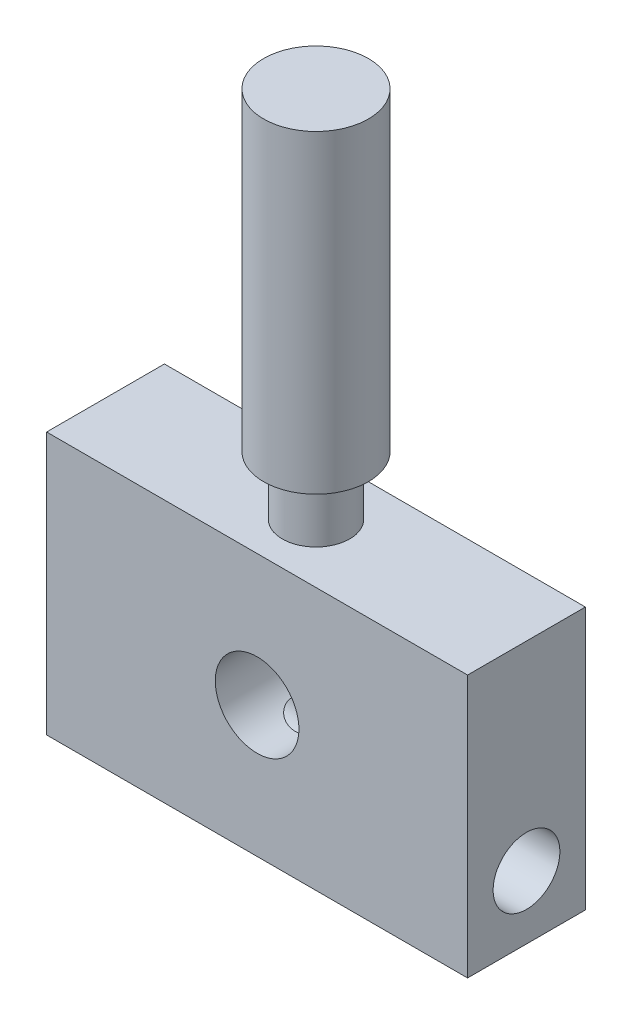
ISO-10303-21;
HEADER;
FILE_DESCRIPTION(('STEP AP214'),'2;1');
FILE_NAME('part.step','',(''),(''),'','','');
FILE_SCHEMA(('AUTOMOTIVE_DESIGN { 1 0 10303 214 1 1 1 1 }'));
ENDSEC;
DATA;
#1=APPLICATION_CONTEXT('core data for automotive mechanical design processes');
#2=APPLICATION_PROTOCOL_DEFINITION('international standard','automotive_design',2000,#1);
#3=PRODUCT_CONTEXT('',#1,'mechanical');
#4=PRODUCT('Part','Part','',(#3));
#5=PRODUCT_RELATED_PRODUCT_CATEGORY('part','',(#4));
#6=PRODUCT_DEFINITION_FORMATION('','',#4);
#7=PRODUCT_DEFINITION_CONTEXT('part definition',#1,'design');
#8=PRODUCT_DEFINITION('design','',#6,#7);
#9=PRODUCT_DEFINITION_SHAPE('','',#8);
#10=(LENGTH_UNIT() NAMED_UNIT(*) SI_UNIT(.MILLI.,.METRE.));
#11=(NAMED_UNIT(*) PLANE_ANGLE_UNIT() SI_UNIT($,.RADIAN.));
#12=(NAMED_UNIT(*) SI_UNIT($,.STERADIAN.) SOLID_ANGLE_UNIT());
#13=UNCERTAINTY_MEASURE_WITH_UNIT(LENGTH_MEASURE(1.E-05),#10,'distance_accuracy_value','');
#14=(GEOMETRIC_REPRESENTATION_CONTEXT(3) GLOBAL_UNCERTAINTY_ASSIGNED_CONTEXT((#13)) GLOBAL_UNIT_ASSIGNED_CONTEXT((#10,
#11,#12)) REPRESENTATION_CONTEXT('',''));
#15=CARTESIAN_POINT('',(0.,0.,0.));
#16=DIRECTION('',(0.,0.,1.));
#17=DIRECTION('',(1.,0.,0.));
#18=AXIS2_PLACEMENT_3D('',#15,#16,#17);
#19=CARTESIAN_POINT('',(53.599909322955,-33.4084973166369,14.9999999999997));
#20=DIRECTION('',(-1.,0.,0.));
#21=DIRECTION('',(0.,0.,1.));
#22=AXIS2_PLACEMENT_3D('',#19,#20,#21);
#23=PLANE('',#22);
#24=CARTESIAN_POINT('',(53.599909322955,-17.2854115069511,0.));
#25=DIRECTION('',(-1.,0.,0.));
#26=DIRECTION('',(0.,0.,1.));
#27=AXIS2_PLACEMENT_3D('',#24,#25,#26);
#28=CIRCLE('',#27,8.5);
#29=CARTESIAN_POINT('',(53.599909322955,-17.2854115069511,8.5));
#30=VERTEX_POINT('',#29);
#31=EDGE_CURVE('E141',#30,#30,#28,.T.);
#32=ORIENTED_EDGE('',*,*,#31,.T.);
#33=EDGE_LOOP('',(#32));
#34=FACE_BOUND('',#33,.T.);
#35=DIRECTION('',(0.,1.,0.));
#36=VECTOR('',#35,1.);
#37=CARTESIAN_POINT('',(53.599909322955,-33.4084973166369,-15.0000000000006));
#38=LINE('',#37,#36);
#39=CARTESIAN_POINT('',(53.599909322955,-33.4084973166369,-15.0000000000006));
#40=VERTEX_POINT('',#39);
#41=CARTESIAN_POINT('',(53.599909322955,33.4084973166368,-15.0000000000006));
#42=VERTEX_POINT('',#41);
#43=EDGE_CURVE('E104',#40,#42,#38,.T.);
#44=ORIENTED_EDGE('',*,*,#43,.T.);
#45=DIRECTION('',(0.,0.,-1.));
#46=VECTOR('',#45,1.);
#47=CARTESIAN_POINT('',(53.599909322955,33.4084973166368,14.9999999999997));
#48=LINE('',#47,#46);
#49=CARTESIAN_POINT('',(53.599909322955,33.4084973166368,14.9999999999997));
#50=VERTEX_POINT('',#49);
#51=EDGE_CURVE('E46',#50,#42,#48,.T.);
#52=ORIENTED_EDGE('',*,*,#51,.F.);
#53=DIRECTION('',(0.,1.,0.));
#54=VECTOR('',#53,1.);
#55=CARTESIAN_POINT('',(53.599909322955,-33.4084973166369,14.9999999999997));
#56=LINE('',#55,#54);
#57=CARTESIAN_POINT('',(53.599909322955,-33.4084973166369,14.9999999999997));
#58=VERTEX_POINT('',#57);
#59=EDGE_CURVE('E90',#58,#50,#56,.T.);
#60=ORIENTED_EDGE('',*,*,#59,.F.);
#61=DIRECTION('',(0.,0.,-1.));
#62=VECTOR('',#61,1.);
#63=CARTESIAN_POINT('',(53.599909322955,-33.4084973166369,14.9999999999997));
#64=LINE('',#63,#62);
#65=EDGE_CURVE('E100',#58,#40,#64,.T.);
#66=ORIENTED_EDGE('',*,*,#65,.T.);
#67=EDGE_LOOP('',(#44,#52,#60,#66));
#68=FACE_BOUND('',#67,.T.);
#69=ADVANCED_FACE('F32',(#34,#68),#23,.F.);
#70=CARTESIAN_POINT('',(-53.5999093229551,33.4084973166369,14.9999999999997));
#71=DIRECTION('',(0.,-1.,0.));
#72=DIRECTION('',(0.,0.,-1.));
#73=AXIS2_PLACEMENT_3D('',#70,#71,#72);
#74=PLANE('',#73);
#75=CARTESIAN_POINT('',(0.,33.4084973166369,0.));
#76=DIRECTION('',(0.,-1.,0.));
#77=DIRECTION('',(0.,0.,-1.));
#78=AXIS2_PLACEMENT_3D('',#75,#76,#77);
#79=CIRCLE('',#78,8.58788191890655);
#80=CARTESIAN_POINT('',(0.,33.4084973166369,-8.58788191890655));
#81=VERTEX_POINT('',#80);
#82=EDGE_CURVE('E11',#81,#81,#79,.F.);
#83=ORIENTED_EDGE('',*,*,#82,.F.);
#84=EDGE_LOOP('',(#83));
#85=FACE_BOUND('',#84,.T.);
#86=DIRECTION('',(-1.,0.,0.));
#87=VECTOR('',#86,1.);
#88=CARTESIAN_POINT('',(-53.599909322955,33.4084973166369,-15.0000000000006));
#89=LINE('',#88,#87);
#90=CARTESIAN_POINT('',(-53.599909322955,33.4084973166369,-15.0000000000006));
#91=VERTEX_POINT('',#90);
#92=EDGE_CURVE('E95',#42,#91,#89,.T.);
#93=ORIENTED_EDGE('',*,*,#92,.T.);
#94=DIRECTION('',(0.,0.,-1.));
#95=VECTOR('',#94,1.);
#96=CARTESIAN_POINT('',(-53.5999093229551,33.4084973166369,14.9999999999997));
#97=LINE('',#96,#95);
#98=CARTESIAN_POINT('',(-53.5999093229551,33.4084973166369,14.9999999999997));
#99=VERTEX_POINT('',#98);
#100=EDGE_CURVE('E93',#99,#91,#97,.T.);
#101=ORIENTED_EDGE('',*,*,#100,.F.);
#102=DIRECTION('',(-1.,0.,0.));
#103=VECTOR('',#102,1.);
#104=CARTESIAN_POINT('',(-53.5999093229551,33.4084973166369,14.9999999999997));
#105=LINE('',#104,#103);
#106=EDGE_CURVE('E85',#50,#99,#105,.T.);
#107=ORIENTED_EDGE('',*,*,#106,.F.);
#108=ORIENTED_EDGE('',*,*,#51,.T.);
#109=EDGE_LOOP('',(#93,#101,#107,#108));
#110=FACE_BOUND('',#109,.T.);
#111=ADVANCED_FACE('F94',(#85,#110),#74,.F.);
#112=CARTESIAN_POINT('',(-53.5999093229551,-33.4084973166368,14.9999999999997));
#113=DIRECTION('',(1.,0.,0.));
#114=DIRECTION('',(0.,0.,-1.));
#115=AXIS2_PLACEMENT_3D('',#112,#113,#114);
#116=PLANE('',#115);
#117=CARTESIAN_POINT('',(-53.5999093229551,-17.2854115069511,0.));
#118=DIRECTION('',(-1.,0.,0.));
#119=DIRECTION('',(0.,0.,1.));
#120=AXIS2_PLACEMENT_3D('',#117,#118,#119);
#121=CIRCLE('',#120,8.5);
#122=CARTESIAN_POINT('',(-53.5999093229551,-17.2854115069511,8.5));
#123=VERTEX_POINT('',#122);
#124=EDGE_CURVE('E144',#123,#123,#121,.T.);
#125=ORIENTED_EDGE('',*,*,#124,.F.);
#126=EDGE_LOOP('',(#125));
#127=FACE_BOUND('',#126,.T.);
#128=DIRECTION('',(0.,-1.,0.));
#129=VECTOR('',#128,1.);
#130=CARTESIAN_POINT('',(-53.599909322955,-33.4084973166368,-15.0000000000006));
#131=LINE('',#130,#129);
#132=CARTESIAN_POINT('',(-53.599909322955,-33.4084973166368,-15.0000000000006));
#133=VERTEX_POINT('',#132);
#134=EDGE_CURVE('E71',#91,#133,#131,.T.);
#135=ORIENTED_EDGE('',*,*,#134,.T.);
#136=DIRECTION('',(0.,0.,-1.));
#137=VECTOR('',#136,1.);
#138=CARTESIAN_POINT('',(-53.5999093229551,-33.4084973166368,14.9999999999997));
#139=LINE('',#138,#137);
#140=CARTESIAN_POINT('',(-53.5999093229551,-33.4084973166368,14.9999999999997));
#141=VERTEX_POINT('',#140);
#142=EDGE_CURVE('E96',#141,#133,#139,.T.);
#143=ORIENTED_EDGE('',*,*,#142,.F.);
#144=DIRECTION('',(0.,-1.,0.));
#145=VECTOR('',#144,1.);
#146=CARTESIAN_POINT('',(-53.5999093229551,-33.4084973166368,14.9999999999997));
#147=LINE('',#146,#145);
#148=EDGE_CURVE('E88',#99,#141,#147,.T.);
#149=ORIENTED_EDGE('',*,*,#148,.F.);
#150=ORIENTED_EDGE('',*,*,#100,.T.);
#151=EDGE_LOOP('',(#135,#143,#149,#150));
#152=FACE_BOUND('',#151,.T.);
#153=ADVANCED_FACE('F98',(#127,#152),#116,.F.);
#154=CARTESIAN_POINT('',(-53.5999093229551,-33.4084973166368,14.9999999999997));
#155=DIRECTION('',(0.,1.,0.));
#156=DIRECTION('',(0.,0.,1.));
#157=AXIS2_PLACEMENT_3D('',#154,#155,#156);
#158=PLANE('',#157);
#159=DIRECTION('',(1.,0.,0.));
#160=VECTOR('',#159,1.);
#161=CARTESIAN_POINT('',(-53.599909322955,-33.4084973166368,-15.0000000000006));
#162=LINE('',#161,#160);
#163=EDGE_CURVE('E77',#133,#40,#162,.T.);
#164=ORIENTED_EDGE('',*,*,#163,.T.);
#165=ORIENTED_EDGE('',*,*,#65,.F.);
#166=DIRECTION('',(1.,0.,0.));
#167=VECTOR('',#166,1.);
#168=CARTESIAN_POINT('',(-53.5999093229551,-33.4084973166368,14.9999999999997));
#169=LINE('',#168,#167);
#170=EDGE_CURVE('E54',#141,#58,#169,.T.);
#171=ORIENTED_EDGE('',*,*,#170,.F.);
#172=ORIENTED_EDGE('',*,*,#142,.T.);
#173=EDGE_LOOP('',(#164,#165,#171,#172));
#174=FACE_BOUND('',#173,.T.);
#175=ADVANCED_FACE('F128',(#174),#158,.F.);
#176=CARTESIAN_POINT('',(0.,0.,14.9999999999997));
#177=DIRECTION('',(0.,0.,-1.));
#178=DIRECTION('',(-1.,0.,0.));
#179=AXIS2_PLACEMENT_3D('',#176,#177,#178);
#180=PLANE('',#179);
#181=CARTESIAN_POINT('',(0.,0.,14.9999999999997));
#182=DIRECTION('',(0.,0.,-1.));
#183=DIRECTION('',(-1.,0.,0.));
#184=AXIS2_PLACEMENT_3D('',#181,#182,#183);
#185=CIRCLE('',#184,10.65);
#186=CARTESIAN_POINT('',(-10.65,0.,14.9999999999997));
#187=VERTEX_POINT('',#186);
#188=EDGE_CURVE('E192',#187,#187,#185,.T.);
#189=ORIENTED_EDGE('',*,*,#188,.T.);
#190=EDGE_LOOP('',(#189));
#191=FACE_BOUND('',#190,.T.);
#192=ORIENTED_EDGE('',*,*,#59,.T.);
#193=ORIENTED_EDGE('',*,*,#106,.T.);
#194=ORIENTED_EDGE('',*,*,#148,.T.);
#195=ORIENTED_EDGE('',*,*,#170,.T.);
#196=EDGE_LOOP('',(#192,#193,#194,#195));
#197=FACE_BOUND('',#196,.T.);
#198=ADVANCED_FACE('F86',(#191,#197),#180,.F.);
#199=CARTESIAN_POINT('',(0.,0.,-15.0000000000006));
#200=DIRECTION('',(0.,0.,-1.));
#201=DIRECTION('',(-1.,0.,0.));
#202=AXIS2_PLACEMENT_3D('',#199,#200,#201);
#203=PLANE('',#202);
#204=CARTESIAN_POINT('',(0.,0.,-15.0000000000006));
#205=DIRECTION('',(0.,0.,-1.));
#206=DIRECTION('',(-1.,0.,0.));
#207=AXIS2_PLACEMENT_3D('',#204,#205,#206);
#208=CIRCLE('',#207,10.65);
#209=CARTESIAN_POINT('',(-10.65,0.,-15.0000000000006));
#210=VERTEX_POINT('',#209);
#211=EDGE_CURVE('E188',#210,#210,#208,.T.);
#212=ORIENTED_EDGE('',*,*,#211,.F.);
#213=EDGE_LOOP('',(#212));
#214=FACE_BOUND('',#213,.T.);
#215=ORIENTED_EDGE('',*,*,#43,.F.);
#216=ORIENTED_EDGE('',*,*,#163,.F.);
#217=ORIENTED_EDGE('',*,*,#134,.F.);
#218=ORIENTED_EDGE('',*,*,#92,.F.);
#219=EDGE_LOOP('',(#215,#216,#217,#218));
#220=FACE_BOUND('',#219,.T.);
#221=ADVANCED_FACE('F116',(#214,#220),#203,.T.);
#222=CARTESIAN_POINT('',(0.,48.4084973166368,0.));
#223=DIRECTION('',(0.,-1.,0.));
#224=DIRECTION('',(0.,0.,-1.));
#225=AXIS2_PLACEMENT_3D('',#222,#223,#224);
#226=CYLINDRICAL_SURFACE('',#225,8.58788191890655);
#227=CARTESIAN_POINT('',(0.,48.4084973166368,0.));
#228=DIRECTION('',(0.,1.,0.));
#229=DIRECTION('',(0.,0.,1.));
#230=AXIS2_PLACEMENT_3D('',#227,#228,#229);
#231=CIRCLE('',#230,8.58788191890655);
#232=CARTESIAN_POINT('',(0.,48.4084973166368,-8.58788191890655));
#233=VERTEX_POINT('',#232);
#234=EDGE_CURVE('E107',#233,#233,#231,.T.);
#235=CARTESIAN_POINT('',(0.,48.4084973166368,-8.58788191890655));
#236=CARTESIAN_POINT('',(0.,48.2522473166368,-8.58788191890655));
#237=CARTESIAN_POINT('',(0.,48.0959973166368,-8.58788191890655));
#238=CARTESIAN_POINT('',(0.,47.7834973166368,-8.58788191890655));
#239=CARTESIAN_POINT('',(0.,47.6272473166368,-8.58788191890655));
#240=CARTESIAN_POINT('',(0.,47.3147473166368,-8.58788191890655));
#241=CARTESIAN_POINT('',(0.,47.1584973166368,-8.58788191890655));
#242=CARTESIAN_POINT('',(0.,46.8459973166368,-8.58788191890655));
#243=CARTESIAN_POINT('',(0.,46.6897473166368,-8.58788191890655));
#244=CARTESIAN_POINT('',(0.,46.3772473166368,-8.58788191890655));
#245=CARTESIAN_POINT('',(0.,46.2209973166368,-8.58788191890655));
#246=CARTESIAN_POINT('',(0.,45.9084973166368,-8.58788191890655));
#247=CARTESIAN_POINT('',(0.,45.7522473166368,-8.58788191890655));
#248=CARTESIAN_POINT('',(0.,45.4397473166368,-8.58788191890655));
#249=CARTESIAN_POINT('',(0.,45.2834973166368,-8.58788191890655));
#250=CARTESIAN_POINT('',(0.,44.9709973166368,-8.58788191890655));
#251=CARTESIAN_POINT('',(0.,44.8147473166368,-8.58788191890655));
#252=CARTESIAN_POINT('',(0.,44.5022473166368,-8.58788191890655));
#253=CARTESIAN_POINT('',(0.,44.3459973166368,-8.58788191890655));
#254=CARTESIAN_POINT('',(0.,44.0334973166368,-8.58788191890655));
#255=CARTESIAN_POINT('',(0.,43.8772473166368,-8.58788191890655));
#256=CARTESIAN_POINT('',(0.,43.5647473166368,-8.58788191890655));
#257=CARTESIAN_POINT('',(0.,43.4084973166368,-8.58788191890655));
#258=CARTESIAN_POINT('',(0.,43.0959973166368,-8.58788191890655));
#259=CARTESIAN_POINT('',(0.,42.9397473166368,-8.58788191890655));
#260=CARTESIAN_POINT('',(0.,42.6272473166368,-8.58788191890655));
#261=CARTESIAN_POINT('',(0.,42.4709973166368,-8.58788191890655));
#262=CARTESIAN_POINT('',(0.,42.1584973166368,-8.58788191890655));
#263=CARTESIAN_POINT('',(0.,42.0022473166368,-8.58788191890655));
#264=CARTESIAN_POINT('',(0.,41.6897473166368,-8.58788191890655));
#265=CARTESIAN_POINT('',(0.,41.5334973166368,-8.58788191890655));
#266=CARTESIAN_POINT('',(0.,41.2209973166368,-8.58788191890655));
#267=CARTESIAN_POINT('',(0.,41.0647473166368,-8.58788191890655));
#268=CARTESIAN_POINT('',(0.,40.7522473166368,-8.58788191890655));
#269=CARTESIAN_POINT('',(0.,40.5959973166368,-8.58788191890655));
#270=CARTESIAN_POINT('',(0.,40.2834973166368,-8.58788191890655));
#271=CARTESIAN_POINT('',(0.,40.1272473166368,-8.58788191890655));
#272=CARTESIAN_POINT('',(0.,39.8147473166369,-8.58788191890655));
#273=CARTESIAN_POINT('',(0.,39.6584973166368,-8.58788191890655));
#274=CARTESIAN_POINT('',(0.,39.3459973166369,-8.58788191890655));
#275=CARTESIAN_POINT('',(0.,39.1897473166369,-8.58788191890655));
#276=CARTESIAN_POINT('',(0.,38.8772473166369,-8.58788191890655));
#277=CARTESIAN_POINT('',(0.,38.7209973166369,-8.58788191890655));
#278=CARTESIAN_POINT('',(0.,38.4084973166369,-8.58788191890655));
#279=CARTESIAN_POINT('',(0.,38.2522473166369,-8.58788191890655));
#280=CARTESIAN_POINT('',(0.,37.9397473166369,-8.58788191890655));
#281=CARTESIAN_POINT('',(0.,37.7834973166369,-8.58788191890655));
#282=CARTESIAN_POINT('',(0.,37.4709973166369,-8.58788191890655));
#283=CARTESIAN_POINT('',(0.,37.3147473166369,-8.58788191890655));
#284=CARTESIAN_POINT('',(0.,37.0022473166369,-8.58788191890655));
#285=CARTESIAN_POINT('',(0.,36.8459973166369,-8.58788191890655));
#286=CARTESIAN_POINT('',(0.,36.5334973166369,-8.58788191890655));
#287=CARTESIAN_POINT('',(0.,36.3772473166369,-8.58788191890655));
#288=CARTESIAN_POINT('',(0.,36.0647473166369,-8.58788191890655));
#289=CARTESIAN_POINT('',(0.,35.9084973166369,-8.58788191890655));
#290=CARTESIAN_POINT('',(0.,35.5959973166369,-8.58788191890655));
#291=CARTESIAN_POINT('',(0.,35.4397473166369,-8.58788191890655));
#292=CARTESIAN_POINT('',(0.,35.1272473166369,-8.58788191890655));
#293=CARTESIAN_POINT('',(0.,34.9709973166369,-8.58788191890655));
#294=CARTESIAN_POINT('',(0.,34.6584973166369,-8.58788191890655));
#295=CARTESIAN_POINT('',(0.,34.5022473166369,-8.58788191890655));
#296=CARTESIAN_POINT('',(0.,34.1897473166369,-8.58788191890655));
#297=CARTESIAN_POINT('',(0.,34.0334973166369,-8.58788191890655));
#298=CARTESIAN_POINT('',(0.,33.7209973166369,-8.58788191890655));
#299=CARTESIAN_POINT('',(0.,33.5647473166369,-8.58788191890655));
#300=CARTESIAN_POINT('',(0.,33.4084973166369,-8.58788191890655));
#301=B_SPLINE_CURVE_WITH_KNOTS('',3,(#235,#236,#237,#238,#239,#240,#241,#242,#243,#244,#245,
#246,#247,#248,#249,#250,#251,#252,#253,#254,#255,#256,#257,#258,#259,#260,#261,#262,#263,#264,
#265,#266,#267,#268,#269,#270,#271,#272,#273,#274,#275,#276,#277,#278,#279,#280,#281,#282,#283,
#284,#285,#286,#287,#288,#289,#290,#291,#292,#293,#294,#295,#296,#297,#298,#299,#300),
.UNSPECIFIED.,.F.,.F.,(4,2,2,2,2,2,2,2,2,2,2,2,2,2,2,2,2,2,2,2,2,2,2,2,2,2,2,2,2,2,2,2,4),(0.,
0.468749999999997,0.937499999999994,1.40624999999999,1.87499999999999,2.34374999999999,
2.81249999999999,3.28124999999999,3.74999999999999,4.21874999999999,4.68749999999998,
5.15624999999998,5.62499999999998,6.09374999999998,6.56249999999998,7.03124999999998,
7.49999999999998,7.96874999999998,8.43749999999997,8.90624999999997,9.37499999999997,
9.84374999999997,10.3125,10.78125,11.25,11.71875,12.1875,12.65625,13.125,13.59375,14.0625,
14.53125,15.),.UNSPECIFIED.);
#302=EDGE_CURVE('BSEAM118',#233,#81,#301,.T.);
#303=ORIENTED_EDGE('',*,*,#234,.F.);
#304=ORIENTED_EDGE('',*,*,#82,.T.);
#305=ORIENTED_EDGE('',*,*,#302,.T.);
#306=ORIENTED_EDGE('',*,*,#302,.F.);
#307=EDGE_LOOP('',(#303,#305,#304,#306));
#308=FACE_BOUND('',#307,.T.);
#309=ADVANCED_FACE('F118',(#308),#226,.T.);
#310=CARTESIAN_POINT('',(0.,128.408497316637,0.));
#311=DIRECTION('',(0.,-1.,0.));
#312=DIRECTION('',(0.,0.,-1.));
#313=AXIS2_PLACEMENT_3D('',#310,#311,#312);
#314=CYLINDRICAL_SURFACE('',#313,13.3418257704174);
#315=CARTESIAN_POINT('',(0.,128.408497316637,0.));
#316=DIRECTION('',(0.,1.,0.));
#317=DIRECTION('',(0.,0.,1.));
#318=AXIS2_PLACEMENT_3D('',#315,#316,#317);
#319=CIRCLE('',#318,13.3418257704174);
#320=CARTESIAN_POINT('',(0.,128.408497316637,-13.3418257704173));
#321=VERTEX_POINT('',#320);
#322=EDGE_CURVE('E147',#321,#321,#319,.T.);
#323=CARTESIAN_POINT('',(0.,48.4084973166368,0.));
#324=DIRECTION('',(0.,1.,0.));
#325=DIRECTION('',(0.,0.,1.));
#326=AXIS2_PLACEMENT_3D('',#323,#324,#325);
#327=CIRCLE('',#326,13.3418257704174);
#328=CARTESIAN_POINT('',(0.,48.4084973166368,-13.3418257704173));
#329=VERTEX_POINT('',#328);
#330=EDGE_CURVE('E143',#329,#329,#327,.T.);
#331=CARTESIAN_POINT('',(0.,128.408497316637,-13.3418257704173));
#332=CARTESIAN_POINT('',(0.,127.575163983303,-13.3418257704173));
#333=CARTESIAN_POINT('',(0.,126.74183064997,-13.3418257704173));
#334=CARTESIAN_POINT('',(0.,125.075163983303,-13.3418257704173));
#335=CARTESIAN_POINT('',(0.,124.24183064997,-13.3418257704173));
#336=CARTESIAN_POINT('',(0.,122.575163983303,-13.3418257704173));
#337=CARTESIAN_POINT('',(0.,121.74183064997,-13.3418257704173));
#338=CARTESIAN_POINT('',(0.,120.075163983303,-13.3418257704173));
#339=CARTESIAN_POINT('',(0.,119.24183064997,-13.3418257704173));
#340=CARTESIAN_POINT('',(0.,117.575163983303,-13.3418257704173));
#341=CARTESIAN_POINT('',(0.,116.74183064997,-13.3418257704173));
#342=CARTESIAN_POINT('',(0.,115.075163983303,-13.3418257704173));
#343=CARTESIAN_POINT('',(0.,114.24183064997,-13.3418257704173));
#344=CARTESIAN_POINT('',(0.,112.575163983303,-13.3418257704173));
#345=CARTESIAN_POINT('',(0.,111.74183064997,-13.3418257704173));
#346=CARTESIAN_POINT('',(0.,110.075163983303,-13.3418257704173));
#347=CARTESIAN_POINT('',(0.,109.24183064997,-13.3418257704173));
#348=CARTESIAN_POINT('',(0.,107.575163983303,-13.3418257704173));
#349=CARTESIAN_POINT('',(0.,106.74183064997,-13.3418257704173));
#350=CARTESIAN_POINT('',(0.,105.075163983303,-13.3418257704173));
#351=CARTESIAN_POINT('',(0.,104.24183064997,-13.3418257704173));
#352=CARTESIAN_POINT('',(0.,102.575163983303,-13.3418257704173));
#353=CARTESIAN_POINT('',(0.,101.74183064997,-13.3418257704173));
#354=CARTESIAN_POINT('',(0.,100.075163983303,-13.3418257704173));
#355=CARTESIAN_POINT('',(0.,99.2418306499701,-13.3418257704173));
#356=CARTESIAN_POINT('',(0.,97.5751639833034,-13.3418257704173));
#357=CARTESIAN_POINT('',(0.,96.7418306499701,-13.3418257704173));
#358=CARTESIAN_POINT('',(0.,95.0751639833034,-13.3418257704173));
#359=CARTESIAN_POINT('',(0.,94.2418306499701,-13.3418257704173));
#360=CARTESIAN_POINT('',(0.,92.5751639833034,-13.3418257704173));
#361=CARTESIAN_POINT('',(0.,91.7418306499701,-13.3418257704173));
#362=CARTESIAN_POINT('',(0.,90.0751639833035,-13.3418257704173));
#363=CARTESIAN_POINT('',(0.,89.2418306499701,-13.3418257704173));
#364=CARTESIAN_POINT('',(0.,87.5751639833035,-13.3418257704173));
#365=CARTESIAN_POINT('',(0.,86.7418306499701,-13.3418257704173));
#366=CARTESIAN_POINT('',(0.,85.0751639833035,-13.3418257704173));
#367=CARTESIAN_POINT('',(0.,84.2418306499701,-13.3418257704173));
#368=CARTESIAN_POINT('',(0.,82.5751639833035,-13.3418257704173));
#369=CARTESIAN_POINT('',(0.,81.7418306499701,-13.3418257704173));
#370=CARTESIAN_POINT('',(0.,80.0751639833035,-13.3418257704173));
#371=CARTESIAN_POINT('',(0.,79.2418306499701,-13.3418257704173));
#372=CARTESIAN_POINT('',(0.,77.5751639833035,-13.3418257704173));
#373=CARTESIAN_POINT('',(0.,76.7418306499701,-13.3418257704173));
#374=CARTESIAN_POINT('',(0.,75.0751639833035,-13.3418257704173));
#375=CARTESIAN_POINT('',(0.,74.2418306499701,-13.3418257704173));
#376=CARTESIAN_POINT('',(0.,72.5751639833035,-13.3418257704173));
#377=CARTESIAN_POINT('',(0.,71.7418306499701,-13.3418257704173));
#378=CARTESIAN_POINT('',(0.,70.0751639833035,-13.3418257704173));
#379=CARTESIAN_POINT('',(0.,69.2418306499702,-13.3418257704173));
#380=CARTESIAN_POINT('',(0.,67.5751639833035,-13.3418257704173));
#381=CARTESIAN_POINT('',(0.,66.7418306499702,-13.3418257704173));
#382=CARTESIAN_POINT('',(0.,65.0751639833035,-13.3418257704173));
#383=CARTESIAN_POINT('',(0.,64.2418306499701,-13.3418257704173));
#384=CARTESIAN_POINT('',(0.,62.5751639833035,-13.3418257704173));
#385=CARTESIAN_POINT('',(0.,61.7418306499702,-13.3418257704173));
#386=CARTESIAN_POINT('',(0.,60.0751639833035,-13.3418257704173));
#387=CARTESIAN_POINT('',(0.,59.2418306499701,-13.3418257704173));
#388=CARTESIAN_POINT('',(0.,57.5751639833035,-13.3418257704173));
#389=CARTESIAN_POINT('',(0.,56.7418306499701,-13.3418257704173));
#390=CARTESIAN_POINT('',(0.,55.0751639833035,-13.3418257704173));
#391=CARTESIAN_POINT('',(0.,54.2418306499701,-13.3418257704173));
#392=CARTESIAN_POINT('',(0.,52.5751639833035,-13.3418257704173));
#393=CARTESIAN_POINT('',(0.,51.7418306499702,-13.3418257704173));
#394=CARTESIAN_POINT('',(0.,50.0751639833035,-13.3418257704173));
#395=CARTESIAN_POINT('',(0.,49.2418306499702,-13.3418257704173));
#396=CARTESIAN_POINT('',(0.,48.4084973166368,-13.3418257704173));
#397=B_SPLINE_CURVE_WITH_KNOTS('',3,(#331,#332,#333,#334,#335,#336,#337,#338,#339,#340,#341,
#342,#343,#344,#345,#346,#347,#348,#349,#350,#351,#352,#353,#354,#355,#356,#357,#358,#359,#360,
#361,#362,#363,#364,#365,#366,#367,#368,#369,#370,#371,#372,#373,#374,#375,#376,#377,#378,#379,
#380,#381,#382,#383,#384,#385,#386,#387,#388,#389,#390,#391,#392,#393,#394,#395,#396),
.UNSPECIFIED.,.F.,.F.,(4,2,2,2,2,2,2,2,2,2,2,2,2,2,2,2,2,2,2,2,2,2,2,2,2,2,2,2,2,2,2,2,4),(0.,
2.5,5.,7.50000000000001,10.,12.5,15.,17.5,20.,22.5,25.,27.5,30.,32.5,35.,37.5,40.,42.5,45.,47.5,
50.,52.5,55.,57.4999999999999,59.9999999999999,62.4999999999999,64.9999999999999,
67.4999999999999,69.9999999999999,72.4999999999999,74.9999999999999,77.4999999999999,
79.9999999999999),.UNSPECIFIED.);
#398=EDGE_CURVE('BSEAM125',#321,#329,#397,.T.);
#399=ORIENTED_EDGE('',*,*,#322,.F.);
#400=ORIENTED_EDGE('',*,*,#330,.T.);
#401=ORIENTED_EDGE('',*,*,#398,.T.);
#402=ORIENTED_EDGE('',*,*,#398,.F.);
#403=EDGE_LOOP('',(#399,#401,#400,#402));
#404=FACE_BOUND('',#403,.T.);
#405=ADVANCED_FACE('F125',(#404),#314,.T.);
#406=CARTESIAN_POINT('',(0.,128.408497316637,0.));
#407=DIRECTION('',(0.,1.,0.));
#408=DIRECTION('',(0.,0.,1.));
#409=AXIS2_PLACEMENT_3D('',#406,#407,#408);
#410=PLANE('',#409);
#411=ORIENTED_EDGE('',*,*,#322,.T.);
#412=EDGE_LOOP('',(#411));
#413=FACE_BOUND('',#412,.T.);
#414=ADVANCED_FACE('F164',(#413),#410,.T.);
#415=CARTESIAN_POINT('',(0.,48.4084973166368,0.));
#416=DIRECTION('',(0.,1.,0.));
#417=DIRECTION('',(0.,0.,1.));
#418=AXIS2_PLACEMENT_3D('',#415,#416,#417);
#419=PLANE('',#418);
#420=ORIENTED_EDGE('',*,*,#234,.T.);
#421=EDGE_LOOP('',(#420));
#422=FACE_BOUND('',#421,.T.);
#423=ORIENTED_EDGE('',*,*,#330,.F.);
#424=EDGE_LOOP('',(#423));
#425=FACE_BOUND('',#424,.T.);
#426=ADVANCED_FACE('F158',(#422,#425),#419,.F.);
#427=CARTESIAN_POINT('',(56.4000906770451,-17.2854115069511,0.));
#428=DIRECTION('',(-1.,0.,0.));
#429=DIRECTION('',(0.,0.,1.));
#430=AXIS2_PLACEMENT_3D('',#427,#428,#429);
#431=CYLINDRICAL_SURFACE('',#430,8.5);
#432=CARTESIAN_POINT('',(6.01988742864279,-8.78541150695106,8.88178419700125E-13));
#433=CARTESIAN_POINT('',(6.01988932925692,-8.78540521103629,-0.140837392119916));
#434=CARTESIAN_POINT('',(6.01478143563576,-8.78891541669128,-0.281619462225108));
#435=CARTESIAN_POINT('',(5.99435903522756,-8.80285951240779,-0.562137687652543));
#436=CARTESIAN_POINT('',(5.97904365585481,-8.81329399438992,-0.701873752524363));
#437=CARTESIAN_POINT('',(5.93822155495126,-8.84084970883005,-0.979185765095903));
#438=CARTESIAN_POINT('',(5.91271392168007,-8.85797153949668,-1.11676151840202));
#439=CARTESIAN_POINT('',(5.85154205469452,-8.89849999417401,-1.38874926780152));
#440=CARTESIAN_POINT('',(5.81587393341032,-8.92190902357404,-1.52316003156498));
#441=CARTESIAN_POINT('',(5.734517544438,-8.97441620591371,-1.78759874210563));
#442=CARTESIAN_POINT('',(5.68884058155293,-9.0035079363548,-1.91763144418462));
#443=CARTESIAN_POINT('',(5.58757295179979,-9.06670229564565,-2.17257366403989));
#444=CARTESIAN_POINT('',(5.53197838134246,-9.10080689663688,-2.29748114061957));
#445=CARTESIAN_POINT('',(5.41114326261037,-9.17316608951075,-2.54118388043553));
#446=CARTESIAN_POINT('',(5.34590880379709,-9.21141805749296,-2.65998293892493));
#447=CARTESIAN_POINT('',(5.20608980335389,-9.29115812553272,-2.89082275081115));
#448=CARTESIAN_POINT('',(5.13150171023291,-9.33264745251391,-3.00286091309516));
#449=CARTESIAN_POINT('',(4.89748855758355,-9.45875178988604,-3.32344176179363));
#450=CARTESIAN_POINT('',(4.72526161339293,-9.54659273392464,-3.52157525688796));
#451=CARTESIAN_POINT('',(4.3505212611365,-9.72307683162713,-3.88617090659091));
#452=CARTESIAN_POINT('',(4.14800256166809,-9.8117201228994,-4.05262751627428));
#453=CARTESIAN_POINT('',(3.81834021208638,-9.94274286446701,-4.28295687862605));
#454=CARTESIAN_POINT('',(3.70004893301094,-9.98743216487297,-4.35848712376404));
#455=CARTESIAN_POINT('',(3.45716313360599,-10.0740811242685,-4.50040283564262));
#456=CARTESIAN_POINT('',(3.33257008035342,-10.1160414134299,-4.56679041755392));
#457=CARTESIAN_POINT('',(3.07782963391522,-10.1964369071523,-4.69061778415971));
#458=CARTESIAN_POINT('',(2.9476786838126,-10.2348698031868,-4.7480517260162));
#459=CARTESIAN_POINT('',(2.68274311853545,-10.3074852304572,-4.85414000962442));
#460=CARTESIAN_POINT('',(2.54795957668837,-10.3416687378746,-4.90279636895043));
#461=CARTESIAN_POINT('',(2.25889534336202,-10.4088589964913,-4.99667223164332));
#462=CARTESIAN_POINT('',(2.10414570853878,-10.4412856863015,-5.04086490300495));
#463=CARTESIAN_POINT('',(1.79087431334061,-10.4995552478651,-5.11903610568623));
#464=CARTESIAN_POINT('',(1.63235230373988,-10.5253976832954,-5.15301396012056));
#465=CARTESIAN_POINT('',(1.31246171490503,-10.5700537317571,-5.21107597938607));
#466=CARTESIAN_POINT('',(1.15109192730986,-10.5888642821016,-5.23515583366801));
#467=CARTESIAN_POINT('',(0.826519297267705,-10.6191307632812,-5.27364184658474));
#468=CARTESIAN_POINT('',(0.663316368096344,-10.6305863446553,-5.28804754556694));
#469=CARTESIAN_POINT('',(0.318926071477032,-10.6467605186788,-5.30834311417511));
#470=CARTESIAN_POINT('',(0.137637070398537,-10.650652539476,-5.31318897374716));
#471=CARTESIAN_POINT('',(-0.224852389211254,-10.6491689031782,-5.31133535892878));
#472=CARTESIAN_POINT('',(-0.40605284056937,-10.6437925902666,-5.30463506754629));
#473=CARTESIAN_POINT('',(-0.767219205411388,-10.6238690750126,-5.2795936777732));
#474=CARTESIAN_POINT('',(-0.947184589975405,-10.6093181645804,-5.2612478726044));
#475=CARTESIAN_POINT('',(-1.30455953275429,-10.5713250835785,-5.21267621730168));
#476=CARTESIAN_POINT('',(-1.48196910027956,-10.5478829454066,-5.18245041045598));
#477=CARTESIAN_POINT('',(-1.83750828286453,-10.4918673121457,-5.10881149392347));
#478=CARTESIAN_POINT('',(-2.01553654474376,-10.4590721133146,-5.06507574831311));
#479=CARTESIAN_POINT('',(-2.36606664977991,-10.3853888642597,-4.96423057105074));
#480=CARTESIAN_POINT('',(-2.53856826955428,-10.3445004873942,-4.90712059959629));
#481=CARTESIAN_POINT('',(-2.87638972515208,-10.2556992670936,-4.77903889463016));
#482=CARTESIAN_POINT('',(-3.04171296189747,-10.2077897981887,-4.70807381485158));
#483=CARTESIAN_POINT('',(-3.36361040077724,-10.1062898664632,-4.55180032469557));
#484=CARTESIAN_POINT('',(-3.52018563671705,-10.0527000770989,-4.46649361395461));
#485=CARTESIAN_POINT('',(-3.81121972700527,-9.94581607271016,-4.28838752308212));
#486=CARTESIAN_POINT('',(-3.94645276973695,-9.89281855335752,-4.19667532141972));
#487=CARTESIAN_POINT('',(-4.20674782438141,-9.78496892574217,-4.00073235183128));
#488=CARTESIAN_POINT('',(-4.33181020159796,-9.73011688418933,-3.89650203385665));
#489=CARTESIAN_POINT('',(-4.57043139026203,-9.62033775229609,-3.67584149225071));
#490=CARTESIAN_POINT('',(-4.68399972149183,-9.56541076288779,-3.55942152985755));
#491=CARTESIAN_POINT('',(-4.89864596504694,-9.45728362180921,-3.31485633335401));
#492=CARTESIAN_POINT('',(-4.99972565274325,-9.40408322548312,-3.18671277037533));
#493=CARTESIAN_POINT('',(-5.17652342738392,-9.30778833038817,-2.93652051577312));
#494=CARTESIAN_POINT('',(-5.25383220884768,-9.26426742362046,-2.81575659337131));
#495=CARTESIAN_POINT('',(-5.39776631155718,-9.18115067878079,-2.56674435361707));
#496=CARTESIAN_POINT('',(-5.46439254263438,-9.14155450654948,-2.43849667492556));
#497=CARTESIAN_POINT('',(-5.58660061876319,-9.06738698231301,-2.17548565722629));
#498=CARTESIAN_POINT('',(-5.64218469204847,-9.03281461691607,-2.04072363960677));
#499=CARTESIAN_POINT('',(-5.74208828907623,-8.96963879074134,-1.76573515979135));
#500=CARTESIAN_POINT('',(-5.78640827712583,-8.94103508394334,-1.62550892310619));
#501=CARTESIAN_POINT('',(-5.86064001867846,-8.89253660143459,-1.35182928516132));
#502=CARTESIAN_POINT('',(-5.89140311454877,-8.87213817358066,-1.21869501474023));
#503=CARTESIAN_POINT('',(-5.94316152149916,-8.83755069665803,-0.949750370725743));
#504=CARTESIAN_POINT('',(-5.96415726747206,-8.82336137112974,-0.813940116561652));
#505=CARTESIAN_POINT('',(-5.99634752760921,-8.80151664562151,-0.540662464897005));
#506=CARTESIAN_POINT('',(-6.00754336988042,-8.7938603602715,-0.40319529450647));
#507=CARTESIAN_POINT('',(-6.02012607886128,-8.78525132469822,-0.127602326274426));
#508=CARTESIAN_POINT('',(-6.02151292771141,-8.78429858668028,0.0105234727658085));
#509=CARTESIAN_POINT('',(-6.01454655811753,-8.78906967661145,0.283652505739775));
#510=CARTESIAN_POINT('',(-6.00638709367018,-8.79466069200346,0.418663062499944));
#511=CARTESIAN_POINT('',(-5.9806496868425,-8.81218312579749,0.687415522385129));
#512=CARTESIAN_POINT('',(-5.96306855651013,-8.8241166902782,0.821156980495284));
#513=CARTESIAN_POINT('',(-5.91851963938271,-8.85405804425435,1.08631100431457));
#514=CARTESIAN_POINT('',(-5.89155628791548,-8.8720629634686,1.21772463967841));
#515=CARTESIAN_POINT('',(-5.8282781636328,-8.91375949235754,1.47741102817941));
#516=CARTESIAN_POINT('',(-5.79195995831012,-8.93745318915621,1.60568260946707));
#517=CARTESIAN_POINT('',(-5.71005869433334,-8.98999969499928,1.85816362334246));
#518=CARTESIAN_POINT('',(-5.66447448866766,-9.01885314270121,1.98237255081398));
#519=CARTESIAN_POINT('',(-5.56417010020728,-9.0810789207029,2.22592298319411));
#520=CARTESIAN_POINT('',(-5.50944663329424,-9.11445287459182,2.34526271914816));
#521=CARTESIAN_POINT('',(-5.3911033477099,-9.18494629912565,2.57822854419512));
#522=CARTESIAN_POINT('',(-5.3274872929052,-9.22206418327786,2.69185702310712));
#523=CARTESIAN_POINT('',(-5.19163777793782,-9.29922107871823,2.91281406182066));
#524=CARTESIAN_POINT('',(-5.1194012602848,-9.33926112446587,3.0201403661202));
#525=CARTESIAN_POINT('',(-4.88725442055252,-9.46405950126935,3.33589561929971));
#526=CARTESIAN_POINT('',(-4.71419214138667,-9.55208054138269,3.5335867805274));
#527=CARTESIAN_POINT('',(-4.33781150619203,-9.72877083741538,3.89721179779808));
#528=CARTESIAN_POINT('',(-4.13448502510354,-9.81744026130957,4.06313709819628));
#529=CARTESIAN_POINT('',(-3.80364184055707,-9.94837966612436,4.29259983816843));
#530=CARTESIAN_POINT('',(-3.6849532869642,-9.99301607135478,4.36781745424781));
#531=CARTESIAN_POINT('',(-3.44129513665953,-10.0795169880574,4.50909577037359));
#532=CARTESIAN_POINT('',(-3.31632694793536,-10.1213821160559,4.57515851070666));
#533=CARTESIAN_POINT('',(-3.06086432505353,-10.2015465972867,4.69832562451672));
#534=CARTESIAN_POINT('',(-2.93036648430685,-10.2398437045446,4.75542437068105));
#535=CARTESIAN_POINT('',(-2.66476405034804,-10.3121516803518,4.86083643637635));
#536=CARTESIAN_POINT('',(-2.52966052441354,-10.3461635334614,4.90915177507632));
#537=CARTESIAN_POINT('',(-2.23990471674418,-10.4129671149393,5.0023160205287));
#538=CARTESIAN_POINT('',(-2.08478543562535,-10.4451731622433,5.0461344770969));
#539=CARTESIAN_POINT('',(-1.77080798071505,-10.502962778904,5.1235457990034));
#540=CARTESIAN_POINT('',(-1.61194955878482,-10.5285459073878,5.15713798362776));
#541=CARTESIAN_POINT('',(-1.2914200290899,-10.5726494389732,5.21441592594675));
#542=CARTESIAN_POINT('',(-1.12974771305488,-10.5911667256961,5.2380973129438));
#543=CARTESIAN_POINT('',(-0.804606891245589,-10.6208174404626,5.27577089246691));
#544=CARTESIAN_POINT('',(-0.641138301607655,-10.6319505222539,5.28976263063748));
#545=CARTESIAN_POINT('',(-0.296317186096745,-10.6474165928138,5.30916198951821));
#546=CARTESIAN_POINT('',(-0.114867838545685,-10.6509247744054,5.31352908057846));
#547=CARTESIAN_POINT('',(0.247891267622431,-10.6486598405135,5.31069942586117));
#548=CARTESIAN_POINT('',(0.429201015472447,-10.642886069323,5.30350186311937));
#549=CARTESIAN_POINT('',(0.790530776688484,-10.6221616465362,5.2774406146907));
#550=CARTESIAN_POINT('',(0.970550243853259,-10.6072073168154,5.25857225315962));
#551=CARTESIAN_POINT('',(1.32797391600348,-10.568410423562,5.20892389826867));
#552=CARTESIAN_POINT('',(1.50537813275454,-10.5445679000288,5.17814395851421));
#553=CARTESIAN_POINT('',(1.86065168491137,-10.487784858536,5.10338436085688));
#554=CARTESIAN_POINT('',(2.03842225580603,-10.4546322492718,5.05909462146662));
#555=CARTESIAN_POINT('',(2.38837448151088,-10.3802776532536,4.95712677168827));
#556=CARTESIAN_POINT('',(2.56055591351898,-10.3390753460698,4.89944812831817));
#557=CARTESIAN_POINT('',(2.89766837750639,-10.2497028498019,4.77021694918311));
#558=CARTESIAN_POINT('',(3.0626030103337,-10.2015361734717,4.6986714015796));
#559=CARTESIAN_POINT('',(3.38365756610642,-10.0995900165437,4.54122862824904));
#560=CARTESIAN_POINT('',(3.53977854481325,-10.045811210414,4.45533312636157));
#561=CARTESIAN_POINT('',(3.8297215993354,-9.93869838387274,4.27619220150952));
#562=CARTESIAN_POINT('',(3.96433263316876,-9.88565882240702,4.18404778150237));
#563=CARTESIAN_POINT('',(4.22335641497377,-9.77780343761904,3.98727985579836));
#564=CARTESIAN_POINT('',(4.3477695256956,-9.72298767757478,3.88265679430438));
#565=CARTESIAN_POINT('',(4.58508525114303,-9.61335389815424,3.6612530228005));
#566=CARTESIAN_POINT('',(4.69799642980684,-9.55853591131415,3.54448149101778));
#567=CARTESIAN_POINT('',(4.9113196516531,-9.45069985591674,3.29927496104644));
#568=CARTESIAN_POINT('',(5.0117335187439,-9.3976815255336,3.17084166956553));
#569=CARTESIAN_POINT('',(5.18730712439098,-9.30177700753897,2.92014484614917));
#570=CARTESIAN_POINT('',(5.26405466387083,-9.25845748423422,2.79915580285527));
#571=CARTESIAN_POINT('',(5.40687050161372,-9.17578663169281,2.54975263467274));
#572=CARTESIAN_POINT('',(5.47293981185452,-9.13643492655839,2.42133921496153));
#573=CARTESIAN_POINT('',(5.59402717363733,-9.06280246769313,2.15809135197972));
#574=CARTESIAN_POINT('',(5.64905118184917,-9.02851898334255,2.02326041843961));
#575=CARTESIAN_POINT('',(5.74785014608845,-8.96594239036047,1.7482425665913));
#576=CARTESIAN_POINT('',(5.79162641554692,-8.93764858236512,1.6080562758417));
#577=CARTESIAN_POINT('',(5.89297144528473,-8.87137084253696,1.22935564336627));
#578=CARTESIAN_POINT('',(5.94056540938333,-8.83932180536447,0.987027476597711));
#579=CARTESIAN_POINT('',(6.00402135706677,-8.79634792962836,0.496408879119254));
#580=CARTESIAN_POINT('',(6.01988408025862,-8.78542259870344,0.248118587513951));
#581=CARTESIAN_POINT('',(6.01988742864279,-8.78541150695106,8.88178419700125E-13));
#582=B_SPLINE_CURVE_WITH_KNOTS('',3,(#432,#433,#434,#435,#436,#437,#438,#439,#440,#441,#442,
#443,#444,#445,#446,#447,#448,#449,#450,#451,#452,#453,#454,#455,#456,#457,#458,#459,#460,#461,
#462,#463,#464,#465,#466,#467,#468,#469,#470,#471,#472,#473,#474,#475,#476,#477,#478,#479,#480,
#481,#482,#483,#484,#485,#486,#487,#488,#489,#490,#491,#492,#493,#494,#495,#496,#497,#498,#499,
#500,#501,#502,#503,#504,#505,#506,#507,#508,#509,#510,#511,#512,#513,#514,#515,#516,#517,#518,
#519,#520,#521,#522,#523,#524,#525,#526,#527,#528,#529,#530,#531,#532,#533,#534,#535,#536,#537,
#538,#539,#540,#541,#542,#543,#544,#545,#546,#547,#548,#549,#550,#551,#552,#553,#554,#555,#556,
#557,#558,#559,#560,#561,#562,#563,#564,#565,#566,#567,#568,#569,#570,#571,#572,#573,#574,#575,
#576,#577,#578,#579,#580,#581),.UNSPECIFIED.,.T.,.F.,(4,2,2,2,2,2,2,2,2,2,2,2,2,2,2,2,2,2,2,2,2,
2,2,2,2,2,2,2,2,2,2,2,2,2,2,2,2,2,2,2,2,2,2,2,2,2,2,2,2,2,2,2,2,2,2,2,2,2,2,2,2,2,2,2,2,2,2,2,2,
2,2,2,2,2,4),(0.,0.422280494148207,0.844597091525501,1.26695147537573,1.68946767651697,
2.11150909091782,2.5337169896228,2.95565931321734,3.37776233236838,4.20436837136593,
5.03111897195956,5.47261113373821,5.91400098334734,6.35567767387079,6.79725271293001,
7.28924907586666,7.78127803378297,8.27352104238438,8.76578743750045,9.30935862165497,
9.85296826984693,10.396797769274,10.9406252871203,11.4986016235266,12.0566004845201,
12.6143320301499,13.1719975251675,13.6866023375393,14.2011886584788,14.7153452314334,
15.2294286281838,15.6783793171618,16.127291748732,16.5761135005492,17.0249167488715,
17.4388840607592,17.8528329389215,18.266725709028,18.6806192327205,19.0862559386006,
19.4920299840582,19.897612464934,20.3033439757035,20.7091257414305,21.1150536364805,
21.5208102362782,21.9267111792291,22.7540848310492,23.5816810106669,24.0236032423692,
24.4654268268472,24.907526674588,25.3495247615651,25.8421352052943,26.334778432575,
26.827638688945,27.3205220543675,27.8645128698508,28.4085421162808,28.9527894664773,
29.4970343674385,30.0548539377001,30.6126957173076,31.1702571026884,31.7277515571117,
32.2416239981237,32.7554781522463,33.2689468681707,33.7823405582935,34.2307949867103,
34.6792068900654,35.127376313824,35.5754933797313,36.3194583198012,37.0634059189765),.UNSPECIFIED.);
#583=CARTESIAN_POINT('',(6.01988742864279,-8.78541150695106,8.88178419700125E-13));
#584=VERTEX_POINT('',#583);
#585=EDGE_CURVE('E35',#584,#584,#582,.T.);
#586=ORIENTED_EDGE('',*,*,#585,.T.);
#587=EDGE_LOOP('',(#586));
#588=FACE_BOUND('',#587,.T.);
#589=ORIENTED_EDGE('',*,*,#124,.T.);
#590=EDGE_LOOP('',(#589));
#591=FACE_BOUND('',#590,.T.);
#592=ORIENTED_EDGE('',*,*,#31,.F.);
#593=EDGE_LOOP('',(#592));
#594=FACE_BOUND('',#593,.T.);
#595=ADVANCED_FACE('F163',(#588,#591,#594),#431,.F.);
#596=CARTESIAN_POINT('',(0.,0.,14.9999999999997));
#597=DIRECTION('',(0.,0.,-1.));
#598=DIRECTION('',(-1.,0.,0.));
#599=AXIS2_PLACEMENT_3D('',#596,#597,#598);
#600=CYLINDRICAL_SURFACE('',#599,10.65);
#601=ORIENTED_EDGE('',*,*,#211,.T.);
#602=EDGE_LOOP('',(#601));
#603=FACE_BOUND('',#602,.T.);
#604=ORIENTED_EDGE('',*,*,#188,.F.);
#605=EDGE_LOOP('',(#604));
#606=FACE_BOUND('',#605,.T.);
#607=ORIENTED_EDGE('',*,*,#585,.F.);
#608=EDGE_LOOP('',(#607));
#609=FACE_BOUND('',#608,.T.);
#610=ADVANCED_FACE('F179',(#603,#606,#609),#600,.F.);
#611=CLOSED_SHELL('',(#69,#111,#153,#175,#198,#221,#309,#405,#414,#426,#595,#610));
#612=MANIFOLD_SOLID_BREP('B2',#611);
#613=ADVANCED_BREP_SHAPE_REPRESENTATION('',(#18,#612),#14);
#614=SHAPE_DEFINITION_REPRESENTATION(#9,#613);
ENDSEC;
END-ISO-10303-21;
